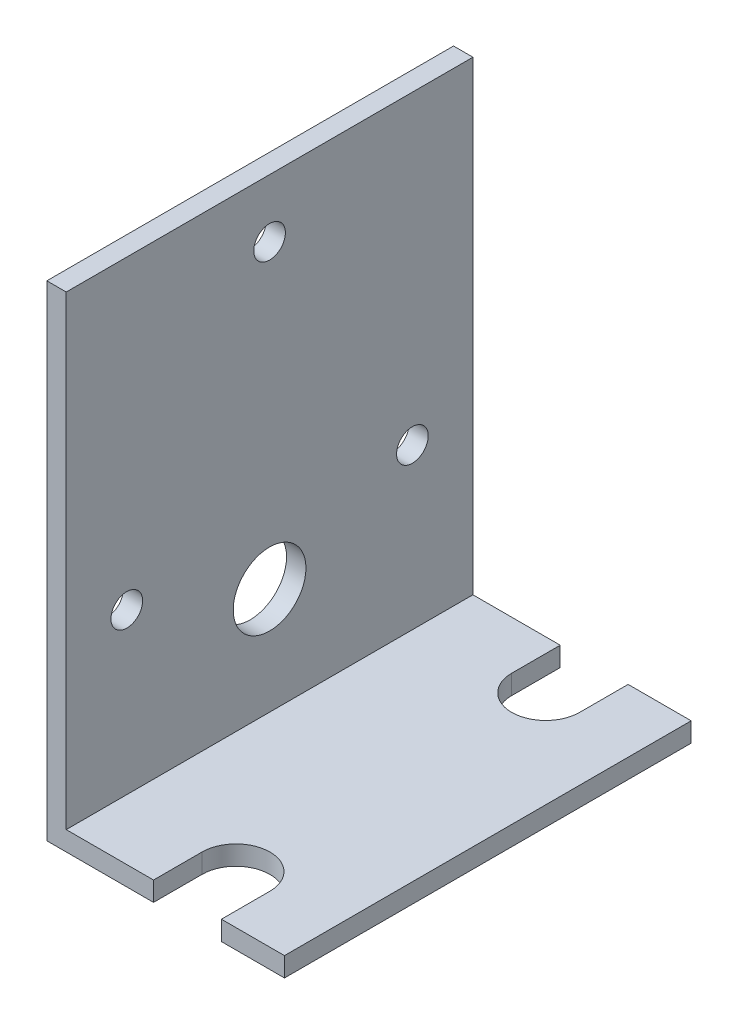
ISO-10303-21;
HEADER;
FILE_DESCRIPTION(('STEP AP214'),'2;1');
FILE_NAME('part.step','',(''),(''),'','','');
FILE_SCHEMA(('AUTOMOTIVE_DESIGN { 1 0 10303 214 1 1 1 1 }'));
ENDSEC;
DATA;
#1=APPLICATION_CONTEXT('core data for automotive mechanical design processes');
#2=APPLICATION_PROTOCOL_DEFINITION('international standard','automotive_design',2000,#1);
#3=PRODUCT_CONTEXT('',#1,'mechanical');
#4=PRODUCT('Part','Part','',(#3));
#5=PRODUCT_RELATED_PRODUCT_CATEGORY('part','',(#4));
#6=PRODUCT_DEFINITION_FORMATION('','',#4);
#7=PRODUCT_DEFINITION_CONTEXT('part definition',#1,'design');
#8=PRODUCT_DEFINITION('design','',#6,#7);
#9=PRODUCT_DEFINITION_SHAPE('','',#8);
#10=(LENGTH_UNIT() NAMED_UNIT(*) SI_UNIT(.MILLI.,.METRE.));
#11=(NAMED_UNIT(*) PLANE_ANGLE_UNIT() SI_UNIT($,.RADIAN.));
#12=(NAMED_UNIT(*) SI_UNIT($,.STERADIAN.) SOLID_ANGLE_UNIT());
#13=UNCERTAINTY_MEASURE_WITH_UNIT(LENGTH_MEASURE(1.E-05),#10,'distance_accuracy_value','');
#14=(GEOMETRIC_REPRESENTATION_CONTEXT(3) GLOBAL_UNCERTAINTY_ASSIGNED_CONTEXT((#13)) GLOBAL_UNIT_ASSIGNED_CONTEXT((#10,
#11,#12)) REPRESENTATION_CONTEXT('',''));
#15=CARTESIAN_POINT('',(0.,0.,0.));
#16=DIRECTION('',(0.,0.,1.));
#17=DIRECTION('',(1.,0.,0.));
#18=AXIS2_PLACEMENT_3D('',#15,#16,#17);
#19=CARTESIAN_POINT('',(2.,2.,-20.965));
#20=DIRECTION('',(0.,1.,0.));
#21=DIRECTION('',(0.,0.,1.));
#22=AXIS2_PLACEMENT_3D('',#19,#20,#21);
#23=PLANE('',#22);
#24=DIRECTION('',(-1.,0.,0.));
#25=VECTOR('',#24,1.);
#26=CARTESIAN_POINT('',(2.,2.,-20.965));
#27=LINE('',#26,#25);
#28=CARTESIAN_POINT('',(24.5,2.,-20.965));
#29=VERTEX_POINT('',#28);
#30=CARTESIAN_POINT('',(18.,2.,-20.965));
#31=VERTEX_POINT('',#30);
#32=EDGE_CURVE('E244',#29,#31,#27,.T.);
#33=ORIENTED_EDGE('',*,*,#32,.T.);
#34=DIRECTION('',(0.,0.,1.));
#35=VECTOR('',#34,1.);
#36=CARTESIAN_POINT('',(18.,2.,-20.965));
#37=LINE('',#36,#35);
#38=CARTESIAN_POINT('',(18.,2.,-15.965));
#39=VERTEX_POINT('',#38);
#40=EDGE_CURVE('E166',#31,#39,#37,.T.);
#41=ORIENTED_EDGE('',*,*,#40,.T.);
#42=CARTESIAN_POINT('',(14.5,2.,-15.965));
#43=DIRECTION('',(0.,-1.,0.));
#44=DIRECTION('',(0.,0.,-1.));
#45=AXIS2_PLACEMENT_3D('',#42,#43,#44);
#46=CIRCLE('',#45,3.5);
#47=CARTESIAN_POINT('',(11.,2.,-15.965));
#48=VERTEX_POINT('',#47);
#49=EDGE_CURVE('E143',#39,#48,#46,.T.);
#50=ORIENTED_EDGE('',*,*,#49,.T.);
#51=DIRECTION('',(0.,0.,-1.));
#52=VECTOR('',#51,1.);
#53=CARTESIAN_POINT('',(11.,2.,-20.965));
#54=LINE('',#53,#52);
#55=CARTESIAN_POINT('',(11.,2.,-20.965));
#56=VERTEX_POINT('',#55);
#57=EDGE_CURVE('E139',#48,#56,#54,.T.);
#58=ORIENTED_EDGE('',*,*,#57,.T.);
#59=CARTESIAN_POINT('',(2.,2.,-20.965));
#60=VERTEX_POINT('',#59);
#61=EDGE_CURVE('E243',#56,#60,#27,.T.);
#62=ORIENTED_EDGE('',*,*,#61,.T.);
#63=DIRECTION('',(0.,0.,1.));
#64=VECTOR('',#63,1.);
#65=CARTESIAN_POINT('',(2.,2.,-20.965));
#66=LINE('',#65,#64);
#67=CARTESIAN_POINT('',(2.,2.,20.965));
#68=VERTEX_POINT('',#67);
#69=EDGE_CURVE('E43',#60,#68,#66,.T.);
#70=ORIENTED_EDGE('',*,*,#69,.T.);
#71=DIRECTION('',(-1.,0.,0.));
#72=VECTOR('',#71,1.);
#73=CARTESIAN_POINT('',(2.,2.,20.965));
#74=LINE('',#73,#72);
#75=CARTESIAN_POINT('',(11.,2.,20.965));
#76=VERTEX_POINT('',#75);
#77=EDGE_CURVE('E225',#76,#68,#74,.T.);
#78=ORIENTED_EDGE('',*,*,#77,.F.);
#79=DIRECTION('',(0.,0.,1.));
#80=VECTOR('',#79,1.);
#81=CARTESIAN_POINT('',(11.,2.,20.965));
#82=LINE('',#81,#80);
#83=CARTESIAN_POINT('',(11.,2.,15.965));
#84=VERTEX_POINT('',#83);
#85=EDGE_CURVE('E171',#84,#76,#82,.T.);
#86=ORIENTED_EDGE('',*,*,#85,.F.);
#87=CARTESIAN_POINT('',(14.5,2.,15.965));
#88=DIRECTION('',(0.,1.,0.));
#89=DIRECTION('',(0.,0.,1.));
#90=AXIS2_PLACEMENT_3D('',#87,#88,#89);
#91=CIRCLE('',#90,3.5);
#92=CARTESIAN_POINT('',(18.,2.,15.965));
#93=VERTEX_POINT('',#92);
#94=EDGE_CURVE('E173',#93,#84,#91,.T.);
#95=ORIENTED_EDGE('',*,*,#94,.F.);
#96=DIRECTION('',(0.,0.,-1.));
#97=VECTOR('',#96,1.);
#98=CARTESIAN_POINT('',(18.,2.,20.965));
#99=LINE('',#98,#97);
#100=CARTESIAN_POINT('',(18.,2.,20.965));
#101=VERTEX_POINT('',#100);
#102=EDGE_CURVE('E152',#101,#93,#99,.T.);
#103=ORIENTED_EDGE('',*,*,#102,.F.);
#104=CARTESIAN_POINT('',(24.5,2.,20.965));
#105=VERTEX_POINT('',#104);
#106=EDGE_CURVE('E226',#105,#101,#74,.T.);
#107=ORIENTED_EDGE('',*,*,#106,.F.);
#108=DIRECTION('',(0.,0.,1.));
#109=VECTOR('',#108,1.);
#110=CARTESIAN_POINT('',(24.5,2.,-20.965));
#111=LINE('',#110,#109);
#112=EDGE_CURVE('E252',#29,#105,#111,.T.);
#113=ORIENTED_EDGE('',*,*,#112,.F.);
#114=EDGE_LOOP('',(#33,#41,#50,#58,#62,#70,#78,#86,#95,#103,#107,#113));
#115=FACE_BOUND('',#114,.T.);
#116=ADVANCED_FACE('F34',(#115),#23,.T.);
#117=CARTESIAN_POINT('',(0.,0.,-20.965));
#118=DIRECTION('',(0.,-1.,0.));
#119=DIRECTION('',(0.,0.,-1.));
#120=AXIS2_PLACEMENT_3D('',#117,#118,#119);
#121=PLANE('',#120);
#122=CARTESIAN_POINT('',(14.5,0.,-15.965));
#123=DIRECTION('',(0.,-1.,0.));
#124=DIRECTION('',(0.,0.,-1.));
#125=AXIS2_PLACEMENT_3D('',#122,#123,#124);
#126=CIRCLE('',#125,3.5);
#127=CARTESIAN_POINT('',(18.,0.,-15.965));
#128=VERTEX_POINT('',#127);
#129=CARTESIAN_POINT('',(11.,0.,-15.965));
#130=VERTEX_POINT('',#129);
#131=EDGE_CURVE('E146',#128,#130,#126,.T.);
#132=ORIENTED_EDGE('',*,*,#131,.F.);
#133=DIRECTION('',(0.,0.,1.));
#134=VECTOR('',#133,1.);
#135=CARTESIAN_POINT('',(18.,0.,-20.965));
#136=LINE('',#135,#134);
#137=CARTESIAN_POINT('',(18.,0.,-20.965));
#138=VERTEX_POINT('',#137);
#139=EDGE_CURVE('E153',#138,#128,#136,.T.);
#140=ORIENTED_EDGE('',*,*,#139,.F.);
#141=DIRECTION('',(1.,0.,0.));
#142=VECTOR('',#141,1.);
#143=CARTESIAN_POINT('',(0.,0.,-20.965));
#144=LINE('',#143,#142);
#145=CARTESIAN_POINT('',(24.5,0.,-20.965));
#146=VERTEX_POINT('',#145);
#147=EDGE_CURVE('E238',#138,#146,#144,.T.);
#148=ORIENTED_EDGE('',*,*,#147,.T.);
#149=DIRECTION('',(0.,0.,1.));
#150=VECTOR('',#149,1.);
#151=CARTESIAN_POINT('',(24.5,0.,-20.965));
#152=LINE('',#151,#150);
#153=CARTESIAN_POINT('',(24.5,0.,20.965));
#154=VERTEX_POINT('',#153);
#155=EDGE_CURVE('E254',#146,#154,#152,.T.);
#156=ORIENTED_EDGE('',*,*,#155,.T.);
#157=DIRECTION('',(1.,0.,0.));
#158=VECTOR('',#157,1.);
#159=CARTESIAN_POINT('',(0.,0.,20.965));
#160=LINE('',#159,#158);
#161=CARTESIAN_POINT('',(18.,0.,20.965));
#162=VERTEX_POINT('',#161);
#163=EDGE_CURVE('E218',#162,#154,#160,.T.);
#164=ORIENTED_EDGE('',*,*,#163,.F.);
#165=DIRECTION('',(0.,0.,-1.));
#166=VECTOR('',#165,1.);
#167=CARTESIAN_POINT('',(18.,0.,20.965));
#168=LINE('',#167,#166);
#169=CARTESIAN_POINT('',(18.,0.,15.965));
#170=VERTEX_POINT('',#169);
#171=EDGE_CURVE('E59',#162,#170,#168,.T.);
#172=ORIENTED_EDGE('',*,*,#171,.T.);
#173=CARTESIAN_POINT('',(14.5,0.,15.965));
#174=DIRECTION('',(0.,-1.,0.));
#175=DIRECTION('',(0.,0.,-1.));
#176=AXIS2_PLACEMENT_3D('',#173,#174,#175);
#177=CIRCLE('',#176,3.5);
#178=CARTESIAN_POINT('',(11.,0.,15.965));
#179=VERTEX_POINT('',#178);
#180=EDGE_CURVE('E185',#170,#179,#177,.F.);
#181=ORIENTED_EDGE('',*,*,#180,.T.);
#182=DIRECTION('',(0.,0.,1.));
#183=VECTOR('',#182,1.);
#184=CARTESIAN_POINT('',(11.,0.,20.965));
#185=LINE('',#184,#183);
#186=CARTESIAN_POINT('',(11.,0.,20.965));
#187=VERTEX_POINT('',#186);
#188=EDGE_CURVE('E180',#179,#187,#185,.T.);
#189=ORIENTED_EDGE('',*,*,#188,.T.);
#190=CARTESIAN_POINT('',(0.,0.,20.965));
#191=VERTEX_POINT('',#190);
#192=EDGE_CURVE('E219',#191,#187,#160,.T.);
#193=ORIENTED_EDGE('',*,*,#192,.F.);
#194=DIRECTION('',(0.,0.,1.));
#195=VECTOR('',#194,1.);
#196=CARTESIAN_POINT('',(0.,0.,-20.965));
#197=LINE('',#196,#195);
#198=CARTESIAN_POINT('',(0.,0.,-20.965));
#199=VERTEX_POINT('',#198);
#200=EDGE_CURVE('E256',#199,#191,#197,.T.);
#201=ORIENTED_EDGE('',*,*,#200,.F.);
#202=CARTESIAN_POINT('',(11.,0.,-20.965));
#203=VERTEX_POINT('',#202);
#204=EDGE_CURVE('E158',#199,#203,#144,.T.);
#205=ORIENTED_EDGE('',*,*,#204,.T.);
#206=DIRECTION('',(0.,0.,-1.));
#207=VECTOR('',#206,1.);
#208=CARTESIAN_POINT('',(11.,0.,-20.965));
#209=LINE('',#208,#207);
#210=EDGE_CURVE('E51',#130,#203,#209,.T.);
#211=ORIENTED_EDGE('',*,*,#210,.F.);
#212=EDGE_LOOP('',(#132,#140,#148,#156,#164,#172,#181,#189,#193,#201,#205,#211));
#213=FACE_BOUND('',#212,.T.);
#214=ADVANCED_FACE('F156',(#213),#121,.T.);
#215=CARTESIAN_POINT('',(0.,0.,-20.965));
#216=DIRECTION('',(0.,0.,-1.));
#217=DIRECTION('',(-1.,0.,0.));
#218=AXIS2_PLACEMENT_3D('',#215,#216,#217);
#219=PLANE('',#218);
#220=ORIENTED_EDGE('',*,*,#147,.F.);
#221=DIRECTION('',(0.,1.,0.));
#222=VECTOR('',#221,1.);
#223=CARTESIAN_POINT('',(18.,-13.8924439894498,-20.965));
#224=LINE('',#223,#222);
#225=EDGE_CURVE('E163',#138,#31,#224,.T.);
#226=ORIENTED_EDGE('',*,*,#225,.T.);
#227=ORIENTED_EDGE('',*,*,#32,.F.);
#228=DIRECTION('',(0.,1.,0.));
#229=VECTOR('',#228,1.);
#230=CARTESIAN_POINT('',(24.5,2.,-20.965));
#231=LINE('',#230,#229);
#232=EDGE_CURVE('E240',#146,#29,#231,.T.);
#233=ORIENTED_EDGE('',*,*,#232,.F.);
#234=EDGE_LOOP('',(#220,#226,#227,#233));
#235=FACE_BOUND('',#234,.T.);
#236=ADVANCED_FACE('F321',(#235),#219,.T.);
#237=ORIENTED_EDGE('',*,*,#61,.F.);
#238=DIRECTION('',(0.,1.,0.));
#239=VECTOR('',#238,1.);
#240=CARTESIAN_POINT('',(11.,-13.8924439894498,-20.965));
#241=LINE('',#240,#239);
#242=EDGE_CURVE('E167',#203,#56,#241,.T.);
#243=ORIENTED_EDGE('',*,*,#242,.F.);
#244=ORIENTED_EDGE('',*,*,#204,.F.);
#245=DIRECTION('',(0.,-1.,0.));
#246=VECTOR('',#245,1.);
#247=CARTESIAN_POINT('',(0.,50.,-20.965));
#248=LINE('',#247,#246);
#249=CARTESIAN_POINT('',(0.,50.,-20.965));
#250=VERTEX_POINT('',#249);
#251=EDGE_CURVE('E235',#250,#199,#248,.T.);
#252=ORIENTED_EDGE('',*,*,#251,.F.);
#253=DIRECTION('',(-1.,0.,0.));
#254=VECTOR('',#253,1.);
#255=CARTESIAN_POINT('',(0.,50.,-20.965));
#256=LINE('',#255,#254);
#257=CARTESIAN_POINT('',(2.,50.,-20.965));
#258=VERTEX_POINT('',#257);
#259=EDGE_CURVE('E232',#258,#250,#256,.T.);
#260=ORIENTED_EDGE('',*,*,#259,.F.);
#261=DIRECTION('',(0.,1.,0.));
#262=VECTOR('',#261,1.);
#263=CARTESIAN_POINT('',(2.,50.,-20.965));
#264=LINE('',#263,#262);
#265=EDGE_CURVE('E247',#60,#258,#264,.T.);
#266=ORIENTED_EDGE('',*,*,#265,.F.);
#267=EDGE_LOOP('',(#237,#243,#244,#252,#260,#266));
#268=FACE_BOUND('',#267,.T.);
#269=ADVANCED_FACE('F275',(#268),#219,.T.);
#270=CARTESIAN_POINT('',(0.,0.,20.965));
#271=DIRECTION('',(0.,0.,-1.));
#272=DIRECTION('',(-1.,0.,0.));
#273=AXIS2_PLACEMENT_3D('',#270,#271,#272);
#274=PLANE('',#273);
#275=ORIENTED_EDGE('',*,*,#192,.T.);
#276=DIRECTION('',(0.,1.,0.));
#277=VECTOR('',#276,1.);
#278=CARTESIAN_POINT('',(11.,-13.8924439894498,20.965));
#279=LINE('',#278,#277);
#280=EDGE_CURVE('E183',#187,#76,#279,.T.);
#281=ORIENTED_EDGE('',*,*,#280,.T.);
#282=ORIENTED_EDGE('',*,*,#77,.T.);
#283=DIRECTION('',(0.,1.,0.));
#284=VECTOR('',#283,1.);
#285=CARTESIAN_POINT('',(2.,50.,20.965));
#286=LINE('',#285,#284);
#287=CARTESIAN_POINT('',(2.,50.,20.965));
#288=VERTEX_POINT('',#287);
#289=EDGE_CURVE('E229',#68,#288,#286,.T.);
#290=ORIENTED_EDGE('',*,*,#289,.T.);
#291=DIRECTION('',(-1.,0.,0.));
#292=VECTOR('',#291,1.);
#293=CARTESIAN_POINT('',(0.,50.,20.965));
#294=LINE('',#293,#292);
#295=CARTESIAN_POINT('',(0.,50.,20.965));
#296=VERTEX_POINT('',#295);
#297=EDGE_CURVE('E212',#288,#296,#294,.T.);
#298=ORIENTED_EDGE('',*,*,#297,.T.);
#299=DIRECTION('',(0.,-1.,0.));
#300=VECTOR('',#299,1.);
#301=CARTESIAN_POINT('',(0.,50.,20.965));
#302=LINE('',#301,#300);
#303=EDGE_CURVE('E215',#296,#191,#302,.T.);
#304=ORIENTED_EDGE('',*,*,#303,.T.);
#305=EDGE_LOOP('',(#275,#281,#282,#290,#298,#304));
#306=FACE_BOUND('',#305,.T.);
#307=ADVANCED_FACE('F266',(#306),#274,.F.);
#308=CARTESIAN_POINT('',(0.,50.,-20.965));
#309=DIRECTION('',(0.,1.,0.));
#310=DIRECTION('',(0.,0.,1.));
#311=AXIS2_PLACEMENT_3D('',#308,#309,#310);
#312=PLANE('',#311);
#313=DIRECTION('',(0.,0.,1.));
#314=VECTOR('',#313,1.);
#315=CARTESIAN_POINT('',(0.,50.,-20.965));
#316=LINE('',#315,#314);
#317=EDGE_CURVE('E38',#250,#296,#316,.T.);
#318=ORIENTED_EDGE('',*,*,#317,.T.);
#319=ORIENTED_EDGE('',*,*,#297,.F.);
#320=DIRECTION('',(0.,0.,1.));
#321=VECTOR('',#320,1.);
#322=CARTESIAN_POINT('',(2.,50.,-20.965));
#323=LINE('',#322,#321);
#324=EDGE_CURVE('E11',#258,#288,#323,.T.);
#325=ORIENTED_EDGE('',*,*,#324,.F.);
#326=ORIENTED_EDGE('',*,*,#259,.T.);
#327=EDGE_LOOP('',(#318,#319,#325,#326));
#328=FACE_BOUND('',#327,.T.);
#329=ADVANCED_FACE('F36',(#328),#312,.T.);
#330=CARTESIAN_POINT('',(2.,50.,-20.965));
#331=DIRECTION('',(1.,0.,0.));
#332=DIRECTION('',(0.,0.,-1.));
#333=AXIS2_PLACEMENT_3D('',#330,#331,#332);
#334=PLANE('',#333);
#335=CARTESIAN_POINT('',(2.,13.,0.));
#336=DIRECTION('',(1.,0.,0.));
#337=DIRECTION('',(0.,0.,-1.));
#338=AXIS2_PLACEMENT_3D('',#335,#336,#337);
#339=CIRCLE('',#338,3.75);
#340=CARTESIAN_POINT('',(2.,13.,-3.75));
#341=VERTEX_POINT('',#340);
#342=EDGE_CURVE('E283',#341,#341,#339,.T.);
#343=ORIENTED_EDGE('',*,*,#342,.F.);
#344=EDGE_LOOP('',(#343));
#345=FACE_BOUND('',#344,.T.);
#346=CARTESIAN_POINT('',(2.,44.,0.));
#347=DIRECTION('',(1.,0.,0.));
#348=DIRECTION('',(0.,0.,-1.));
#349=AXIS2_PLACEMENT_3D('',#346,#347,#348);
#350=CIRCLE('',#349,1.63194999999999);
#351=CARTESIAN_POINT('',(2.,44.,-1.63194999999999));
#352=VERTEX_POINT('',#351);
#353=EDGE_CURVE('E194',#352,#352,#350,.T.);
#354=ORIENTED_EDGE('',*,*,#353,.F.);
#355=EDGE_LOOP('',(#354));
#356=FACE_BOUND('',#355,.T.);
#357=CARTESIAN_POINT('',(2.,18.5,14.7224318643355));
#358=DIRECTION('',(1.,0.,0.));
#359=DIRECTION('',(0.,0.,-1.));
#360=AXIS2_PLACEMENT_3D('',#357,#358,#359);
#361=CIRCLE('',#360,1.63194999999999);
#362=CARTESIAN_POINT('',(2.,18.5,13.0904818643355));
#363=VERTEX_POINT('',#362);
#364=EDGE_CURVE('E200',#363,#363,#361,.T.);
#365=ORIENTED_EDGE('',*,*,#364,.F.);
#366=EDGE_LOOP('',(#365));
#367=FACE_BOUND('',#366,.T.);
#368=CARTESIAN_POINT('',(2.,18.5,-14.7224318643355));
#369=DIRECTION('',(1.,0.,0.));
#370=DIRECTION('',(0.,0.,-1.));
#371=AXIS2_PLACEMENT_3D('',#368,#369,#370);
#372=CIRCLE('',#371,1.63194999999999);
#373=CARTESIAN_POINT('',(2.,18.5,-16.3543818643355));
#374=VERTEX_POINT('',#373);
#375=EDGE_CURVE('E206',#374,#374,#372,.T.);
#376=ORIENTED_EDGE('',*,*,#375,.F.);
#377=EDGE_LOOP('',(#376));
#378=FACE_BOUND('',#377,.T.);
#379=ORIENTED_EDGE('',*,*,#324,.T.);
#380=ORIENTED_EDGE('',*,*,#289,.F.);
#381=ORIENTED_EDGE('',*,*,#69,.F.);
#382=ORIENTED_EDGE('',*,*,#265,.T.);
#383=EDGE_LOOP('',(#379,#380,#381,#382));
#384=FACE_BOUND('',#383,.T.);
#385=ADVANCED_FACE('F271',(#345,#356,#367,#378,#384),#334,.T.);
#386=CARTESIAN_POINT('',(24.5,2.,-20.965));
#387=DIRECTION('',(1.,0.,0.));
#388=DIRECTION('',(0.,0.,-1.));
#389=AXIS2_PLACEMENT_3D('',#386,#387,#388);
#390=PLANE('',#389);
#391=ORIENTED_EDGE('',*,*,#112,.T.);
#392=DIRECTION('',(0.,1.,0.));
#393=VECTOR('',#392,1.);
#394=CARTESIAN_POINT('',(24.5,2.,20.965));
#395=LINE('',#394,#393);
#396=EDGE_CURVE('E222',#154,#105,#395,.T.);
#397=ORIENTED_EDGE('',*,*,#396,.F.);
#398=ORIENTED_EDGE('',*,*,#155,.F.);
#399=ORIENTED_EDGE('',*,*,#232,.T.);
#400=EDGE_LOOP('',(#391,#397,#398,#399));
#401=FACE_BOUND('',#400,.T.);
#402=ADVANCED_FACE('F292',(#401),#390,.T.);
#403=CARTESIAN_POINT('',(0.,50.,-20.965));
#404=DIRECTION('',(-1.,0.,0.));
#405=DIRECTION('',(0.,0.,1.));
#406=AXIS2_PLACEMENT_3D('',#403,#404,#405);
#407=PLANE('',#406);
#408=CARTESIAN_POINT('',(0.,13.,0.));
#409=DIRECTION('',(-1.,0.,0.));
#410=DIRECTION('',(0.,0.,1.));
#411=AXIS2_PLACEMENT_3D('',#408,#409,#410);
#412=CIRCLE('',#411,3.75);
#413=CARTESIAN_POINT('',(0.,13.,3.75));
#414=VERTEX_POINT('',#413);
#415=EDGE_CURVE('E170',#414,#414,#412,.F.);
#416=ORIENTED_EDGE('',*,*,#415,.T.);
#417=EDGE_LOOP('',(#416));
#418=FACE_BOUND('',#417,.T.);
#419=CARTESIAN_POINT('',(0.,44.,0.));
#420=DIRECTION('',(-1.,0.,0.));
#421=DIRECTION('',(0.,0.,1.));
#422=AXIS2_PLACEMENT_3D('',#419,#420,#421);
#423=CIRCLE('',#422,1.63194999999999);
#424=CARTESIAN_POINT('',(0.,44.,1.63194999999999));
#425=VERTEX_POINT('',#424);
#426=EDGE_CURVE('E197',#425,#425,#423,.F.);
#427=ORIENTED_EDGE('',*,*,#426,.T.);
#428=EDGE_LOOP('',(#427));
#429=FACE_BOUND('',#428,.T.);
#430=CARTESIAN_POINT('',(0.,18.5,14.7224318643355));
#431=DIRECTION('',(-1.,0.,0.));
#432=DIRECTION('',(0.,0.,1.));
#433=AXIS2_PLACEMENT_3D('',#430,#431,#432);
#434=CIRCLE('',#433,1.63194999999999);
#435=CARTESIAN_POINT('',(0.,18.5,16.3543818643355));
#436=VERTEX_POINT('',#435);
#437=EDGE_CURVE('E203',#436,#436,#434,.F.);
#438=ORIENTED_EDGE('',*,*,#437,.T.);
#439=EDGE_LOOP('',(#438));
#440=FACE_BOUND('',#439,.T.);
#441=CARTESIAN_POINT('',(0.,18.5,-14.7224318643355));
#442=DIRECTION('',(-1.,0.,0.));
#443=DIRECTION('',(0.,0.,1.));
#444=AXIS2_PLACEMENT_3D('',#441,#442,#443);
#445=CIRCLE('',#444,1.63194999999999);
#446=CARTESIAN_POINT('',(0.,18.5,-13.0904818643355));
#447=VERTEX_POINT('',#446);
#448=EDGE_CURVE('E209',#447,#447,#445,.F.);
#449=ORIENTED_EDGE('',*,*,#448,.T.);
#450=EDGE_LOOP('',(#449));
#451=FACE_BOUND('',#450,.T.);
#452=ORIENTED_EDGE('',*,*,#200,.T.);
#453=ORIENTED_EDGE('',*,*,#303,.F.);
#454=ORIENTED_EDGE('',*,*,#317,.F.);
#455=ORIENTED_EDGE('',*,*,#251,.T.);
#456=EDGE_LOOP('',(#452,#453,#454,#455));
#457=FACE_BOUND('',#456,.T.);
#458=ADVANCED_FACE('F263',(#418,#429,#440,#451,#457),#407,.T.);
#459=ORIENTED_EDGE('',*,*,#106,.T.);
#460=DIRECTION('',(0.,1.,0.));
#461=VECTOR('',#460,1.);
#462=CARTESIAN_POINT('',(18.,-13.8924439894498,20.965));
#463=LINE('',#462,#461);
#464=EDGE_CURVE('E190',#162,#101,#463,.T.);
#465=ORIENTED_EDGE('',*,*,#464,.F.);
#466=ORIENTED_EDGE('',*,*,#163,.T.);
#467=ORIENTED_EDGE('',*,*,#396,.T.);
#468=EDGE_LOOP('',(#459,#465,#466,#467));
#469=FACE_BOUND('',#468,.T.);
#470=ADVANCED_FACE('F303',(#469),#274,.F.);
#471=CARTESIAN_POINT('',(2.,18.5,-14.7224318643355));
#472=DIRECTION('',(1.,0.,0.));
#473=DIRECTION('',(0.,0.,-1.));
#474=AXIS2_PLACEMENT_3D('',#471,#472,#473);
#475=CYLINDRICAL_SURFACE('',#474,1.63194999999999);
#476=ORIENTED_EDGE('',*,*,#448,.F.);
#477=EDGE_LOOP('',(#476));
#478=FACE_BOUND('',#477,.T.);
#479=ORIENTED_EDGE('',*,*,#375,.T.);
#480=EDGE_LOOP('',(#479));
#481=FACE_BOUND('',#480,.T.);
#482=ADVANCED_FACE('F300',(#478,#481),#475,.F.);
#483=CARTESIAN_POINT('',(2.,18.5,14.7224318643355));
#484=DIRECTION('',(1.,0.,0.));
#485=DIRECTION('',(0.,0.,-1.));
#486=AXIS2_PLACEMENT_3D('',#483,#484,#485);
#487=CYLINDRICAL_SURFACE('',#486,1.63194999999999);
#488=ORIENTED_EDGE('',*,*,#437,.F.);
#489=EDGE_LOOP('',(#488));
#490=FACE_BOUND('',#489,.T.);
#491=ORIENTED_EDGE('',*,*,#364,.T.);
#492=EDGE_LOOP('',(#491));
#493=FACE_BOUND('',#492,.T.);
#494=ADVANCED_FACE('F302',(#490,#493),#487,.F.);
#495=CARTESIAN_POINT('',(2.,44.,0.));
#496=DIRECTION('',(1.,0.,0.));
#497=DIRECTION('',(0.,0.,-1.));
#498=AXIS2_PLACEMENT_3D('',#495,#496,#497);
#499=CYLINDRICAL_SURFACE('',#498,1.63194999999999);
#500=ORIENTED_EDGE('',*,*,#426,.F.);
#501=EDGE_LOOP('',(#500));
#502=FACE_BOUND('',#501,.T.);
#503=ORIENTED_EDGE('',*,*,#353,.T.);
#504=EDGE_LOOP('',(#503));
#505=FACE_BOUND('',#504,.T.);
#506=ADVANCED_FACE('F310',(#502,#505),#499,.F.);
#507=CARTESIAN_POINT('',(18.,-13.8924439894498,20.965));
#508=DIRECTION('',(1.,0.,0.));
#509=DIRECTION('',(0.,0.,-1.));
#510=AXIS2_PLACEMENT_3D('',#507,#508,#509);
#511=PLANE('',#510);
#512=ORIENTED_EDGE('',*,*,#464,.T.);
#513=ORIENTED_EDGE('',*,*,#102,.T.);
#514=DIRECTION('',(0.,1.,0.));
#515=VECTOR('',#514,1.);
#516=CARTESIAN_POINT('',(18.,-13.8924439894498,15.965));
#517=LINE('',#516,#515);
#518=EDGE_CURVE('E179',#170,#93,#517,.T.);
#519=ORIENTED_EDGE('',*,*,#518,.F.);
#520=ORIENTED_EDGE('',*,*,#171,.F.);
#521=EDGE_LOOP('',(#512,#513,#519,#520));
#522=FACE_BOUND('',#521,.T.);
#523=ADVANCED_FACE('F342',(#522),#511,.F.);
#524=CARTESIAN_POINT('',(14.5,-13.8924439894498,15.965));
#525=DIRECTION('',(0.,1.,0.));
#526=DIRECTION('',(0.,0.,1.));
#527=AXIS2_PLACEMENT_3D('',#524,#525,#526);
#528=CYLINDRICAL_SURFACE('',#527,3.5);
#529=ORIENTED_EDGE('',*,*,#518,.T.);
#530=ORIENTED_EDGE('',*,*,#94,.T.);
#531=DIRECTION('',(0.,1.,0.));
#532=VECTOR('',#531,1.);
#533=CARTESIAN_POINT('',(11.,-13.8924439894498,15.965));
#534=LINE('',#533,#532);
#535=EDGE_CURVE('E184',#179,#84,#534,.T.);
#536=ORIENTED_EDGE('',*,*,#535,.F.);
#537=ORIENTED_EDGE('',*,*,#180,.F.);
#538=EDGE_LOOP('',(#529,#530,#536,#537));
#539=FACE_BOUND('',#538,.T.);
#540=ADVANCED_FACE('F347',(#539),#528,.F.);
#541=CARTESIAN_POINT('',(11.,-13.8924439894498,20.965));
#542=DIRECTION('',(-1.,0.,0.));
#543=DIRECTION('',(0.,0.,1.));
#544=AXIS2_PLACEMENT_3D('',#541,#542,#543);
#545=PLANE('',#544);
#546=ORIENTED_EDGE('',*,*,#535,.T.);
#547=ORIENTED_EDGE('',*,*,#85,.T.);
#548=ORIENTED_EDGE('',*,*,#280,.F.);
#549=ORIENTED_EDGE('',*,*,#188,.F.);
#550=EDGE_LOOP('',(#546,#547,#548,#549));
#551=FACE_BOUND('',#550,.T.);
#552=ADVANCED_FACE('F352',(#551),#545,.F.);
#553=CARTESIAN_POINT('',(18.,-13.8924439894498,-20.965));
#554=DIRECTION('',(-1.,0.,0.));
#555=DIRECTION('',(0.,0.,1.));
#556=AXIS2_PLACEMENT_3D('',#553,#554,#555);
#557=PLANE('',#556);
#558=ORIENTED_EDGE('',*,*,#139,.T.);
#559=DIRECTION('',(0.,1.,0.));
#560=VECTOR('',#559,1.);
#561=CARTESIAN_POINT('',(18.,-13.8924439894498,-15.965));
#562=LINE('',#561,#560);
#563=EDGE_CURVE('E148',#128,#39,#562,.T.);
#564=ORIENTED_EDGE('',*,*,#563,.T.);
#565=ORIENTED_EDGE('',*,*,#40,.F.);
#566=ORIENTED_EDGE('',*,*,#225,.F.);
#567=EDGE_LOOP('',(#558,#564,#565,#566));
#568=FACE_BOUND('',#567,.T.);
#569=ADVANCED_FACE('F356',(#568),#557,.T.);
#570=CARTESIAN_POINT('',(14.5,-13.8924439894498,-15.965));
#571=DIRECTION('',(0.,1.,0.));
#572=DIRECTION('',(0.,0.,1.));
#573=AXIS2_PLACEMENT_3D('',#570,#571,#572);
#574=CYLINDRICAL_SURFACE('',#573,3.5);
#575=ORIENTED_EDGE('',*,*,#131,.T.);
#576=DIRECTION('',(0.,1.,0.));
#577=VECTOR('',#576,1.);
#578=CARTESIAN_POINT('',(11.,-13.8924439894498,-15.965));
#579=LINE('',#578,#577);
#580=EDGE_CURVE('E135',#130,#48,#579,.T.);
#581=ORIENTED_EDGE('',*,*,#580,.T.);
#582=ORIENTED_EDGE('',*,*,#49,.F.);
#583=ORIENTED_EDGE('',*,*,#563,.F.);
#584=EDGE_LOOP('',(#575,#581,#582,#583));
#585=FACE_BOUND('',#584,.T.);
#586=ADVANCED_FACE('F147',(#585),#574,.F.);
#587=CARTESIAN_POINT('',(11.,-13.8924439894498,-20.965));
#588=DIRECTION('',(1.,0.,0.));
#589=DIRECTION('',(0.,0.,-1.));
#590=AXIS2_PLACEMENT_3D('',#587,#588,#589);
#591=PLANE('',#590);
#592=ORIENTED_EDGE('',*,*,#210,.T.);
#593=ORIENTED_EDGE('',*,*,#242,.T.);
#594=ORIENTED_EDGE('',*,*,#57,.F.);
#595=ORIENTED_EDGE('',*,*,#580,.F.);
#596=EDGE_LOOP('',(#592,#593,#594,#595));
#597=FACE_BOUND('',#596,.T.);
#598=ADVANCED_FACE('F137',(#597),#591,.T.);
#599=CARTESIAN_POINT('',(-10.6066017177982,13.,0.));
#600=DIRECTION('',(1.,0.,0.));
#601=DIRECTION('',(0.,0.,-1.));
#602=AXIS2_PLACEMENT_3D('',#599,#600,#601);
#603=CYLINDRICAL_SURFACE('',#602,3.75);
#604=ORIENTED_EDGE('',*,*,#342,.T.);
#605=EDGE_LOOP('',(#604));
#606=FACE_BOUND('',#605,.T.);
#607=ORIENTED_EDGE('',*,*,#415,.F.);
#608=EDGE_LOOP('',(#607));
#609=FACE_BOUND('',#608,.T.);
#610=ADVANCED_FACE('F287',(#606,#609),#603,.F.);
#611=CLOSED_SHELL('',(#116,#214,#236,#269,#307,#329,#385,#402,#458,#470,#482,#494,#506,#523,
#540,#552,#569,#586,#598,#610));
#612=MANIFOLD_SOLID_BREP('B2',#611);
#613=ADVANCED_BREP_SHAPE_REPRESENTATION('',(#18,#612),#14);
#614=SHAPE_DEFINITION_REPRESENTATION(#9,#613);
ENDSEC;
END-ISO-10303-21;
